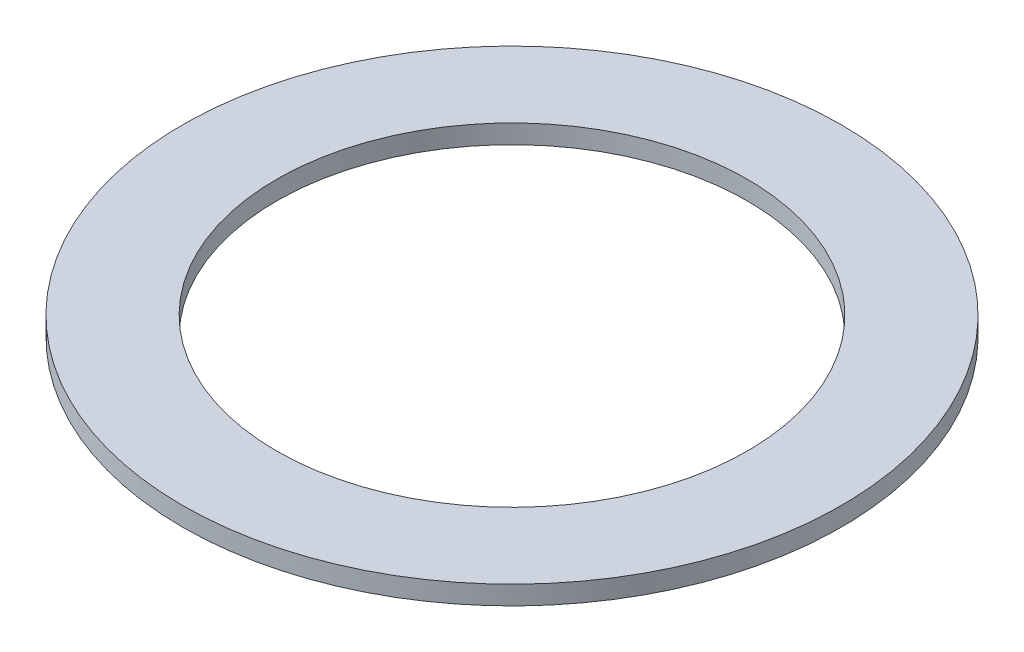
ISO-10303-21;
HEADER;
FILE_DESCRIPTION(('STEP AP214'),'2;1');
FILE_NAME('part.step','',(''),(''),'','','');
FILE_SCHEMA(('AUTOMOTIVE_DESIGN { 1 0 10303 214 1 1 1 1 }'));
ENDSEC;
DATA;
#1=APPLICATION_CONTEXT('core data for automotive mechanical design processes');
#2=APPLICATION_PROTOCOL_DEFINITION('international standard','automotive_design',2000,#1);
#3=PRODUCT_CONTEXT('',#1,'mechanical');
#4=PRODUCT('Part','Part','',(#3));
#5=PRODUCT_RELATED_PRODUCT_CATEGORY('part','',(#4));
#6=PRODUCT_DEFINITION_FORMATION('','',#4);
#7=PRODUCT_DEFINITION_CONTEXT('part definition',#1,'design');
#8=PRODUCT_DEFINITION('design','',#6,#7);
#9=PRODUCT_DEFINITION_SHAPE('','',#8);
#10=(LENGTH_UNIT() NAMED_UNIT(*) SI_UNIT(.MILLI.,.METRE.));
#11=(NAMED_UNIT(*) PLANE_ANGLE_UNIT() SI_UNIT($,.RADIAN.));
#12=(NAMED_UNIT(*) SI_UNIT($,.STERADIAN.) SOLID_ANGLE_UNIT());
#13=UNCERTAINTY_MEASURE_WITH_UNIT(LENGTH_MEASURE(1.E-05),#10,'distance_accuracy_value','');
#14=(GEOMETRIC_REPRESENTATION_CONTEXT(3) GLOBAL_UNCERTAINTY_ASSIGNED_CONTEXT((#13)) GLOBAL_UNIT_ASSIGNED_CONTEXT((#10,
#11,#12)) REPRESENTATION_CONTEXT('',''));
#15=CARTESIAN_POINT('',(0.,0.,0.));
#16=DIRECTION('',(0.,0.,1.));
#17=DIRECTION('',(1.,0.,0.));
#18=AXIS2_PLACEMENT_3D('',#15,#16,#17);
#19=CARTESIAN_POINT('',(0.,2.,0.));
#20=DIRECTION('',(0.,1.,0.));
#21=DIRECTION('',(0.,0.,1.));
#22=AXIS2_PLACEMENT_3D('',#19,#20,#21);
#23=PLANE('',#22);
#24=CARTESIAN_POINT('',(0.,2.,0.));
#25=DIRECTION('',(0.,1.,0.));
#26=DIRECTION('',(0.,0.,1.));
#27=AXIS2_PLACEMENT_3D('',#24,#25,#26);
#28=CIRCLE('',#27,35.);
#29=CARTESIAN_POINT('',(0.,2.,35.));
#30=VERTEX_POINT('',#29);
#31=EDGE_CURVE('E11',#30,#30,#28,.T.);
#32=ORIENTED_EDGE('',*,*,#31,.T.);
#33=EDGE_LOOP('',(#32));
#34=FACE_BOUND('',#33,.T.);
#35=CARTESIAN_POINT('',(0.,2.,0.));
#36=DIRECTION('',(0.,1.,0.));
#37=DIRECTION('',(0.,0.,1.));
#38=AXIS2_PLACEMENT_3D('',#35,#36,#37);
#39=CIRCLE('',#38,25.);
#40=CARTESIAN_POINT('',(0.,2.,25.));
#41=VERTEX_POINT('',#40);
#42=EDGE_CURVE('E53',#41,#41,#39,.T.);
#43=ORIENTED_EDGE('',*,*,#42,.F.);
#44=EDGE_LOOP('',(#43));
#45=FACE_BOUND('',#44,.T.);
#46=ADVANCED_FACE('F43',(#34,#45),#23,.T.);
#47=CARTESIAN_POINT('',(0.,0.,0.));
#48=DIRECTION('',(0.,1.,0.));
#49=DIRECTION('',(0.,0.,1.));
#50=AXIS2_PLACEMENT_3D('',#47,#48,#49);
#51=PLANE('',#50);
#52=CARTESIAN_POINT('',(0.,0.,0.));
#53=DIRECTION('',(0.,1.,0.));
#54=DIRECTION('',(0.,0.,1.));
#55=AXIS2_PLACEMENT_3D('',#52,#53,#54);
#56=CIRCLE('',#55,35.);
#57=CARTESIAN_POINT('',(0.,0.,35.));
#58=VERTEX_POINT('',#57);
#59=EDGE_CURVE('E50',#58,#58,#56,.T.);
#60=ORIENTED_EDGE('',*,*,#59,.F.);
#61=EDGE_LOOP('',(#60));
#62=FACE_BOUND('',#61,.T.);
#63=CARTESIAN_POINT('',(0.,0.,0.));
#64=DIRECTION('',(0.,1.,0.));
#65=DIRECTION('',(0.,0.,1.));
#66=AXIS2_PLACEMENT_3D('',#63,#64,#65);
#67=CIRCLE('',#66,25.);
#68=CARTESIAN_POINT('',(0.,0.,25.));
#69=VERTEX_POINT('',#68);
#70=EDGE_CURVE('E57',#69,#69,#67,.T.);
#71=ORIENTED_EDGE('',*,*,#70,.T.);
#72=EDGE_LOOP('',(#71));
#73=FACE_BOUND('',#72,.T.);
#74=ADVANCED_FACE('F67',(#62,#73),#51,.F.);
#75=CARTESIAN_POINT('',(0.,2.,0.));
#76=DIRECTION('',(0.,-1.,0.));
#77=DIRECTION('',(0.,0.,-1.));
#78=AXIS2_PLACEMENT_3D('',#75,#76,#77);
#79=CYLINDRICAL_SURFACE('',#78,35.);
#80=ORIENTED_EDGE('',*,*,#31,.F.);
#81=EDGE_LOOP('',(#80));
#82=FACE_BOUND('',#81,.T.);
#83=ORIENTED_EDGE('',*,*,#59,.T.);
#84=EDGE_LOOP('',(#83));
#85=FACE_BOUND('',#84,.T.);
#86=ADVANCED_FACE('F44',(#82,#85),#79,.T.);
#87=CARTESIAN_POINT('',(0.,2.,0.));
#88=DIRECTION('',(0.,-1.,0.));
#89=DIRECTION('',(0.,0.,-1.));
#90=AXIS2_PLACEMENT_3D('',#87,#88,#89);
#91=CYLINDRICAL_SURFACE('',#90,25.);
#92=ORIENTED_EDGE('',*,*,#42,.T.);
#93=EDGE_LOOP('',(#92));
#94=FACE_BOUND('',#93,.T.);
#95=ORIENTED_EDGE('',*,*,#70,.F.);
#96=EDGE_LOOP('',(#95));
#97=FACE_BOUND('',#96,.T.);
#98=ADVANCED_FACE('F64',(#94,#97),#91,.F.);
#99=CLOSED_SHELL('',(#46,#74,#86,#98));
#100=MANIFOLD_SOLID_BREP('B2',#99);
#101=ADVANCED_BREP_SHAPE_REPRESENTATION('',(#18,#100),#14);
#102=SHAPE_DEFINITION_REPRESENTATION(#9,#101);
ENDSEC;
END-ISO-10303-21;
